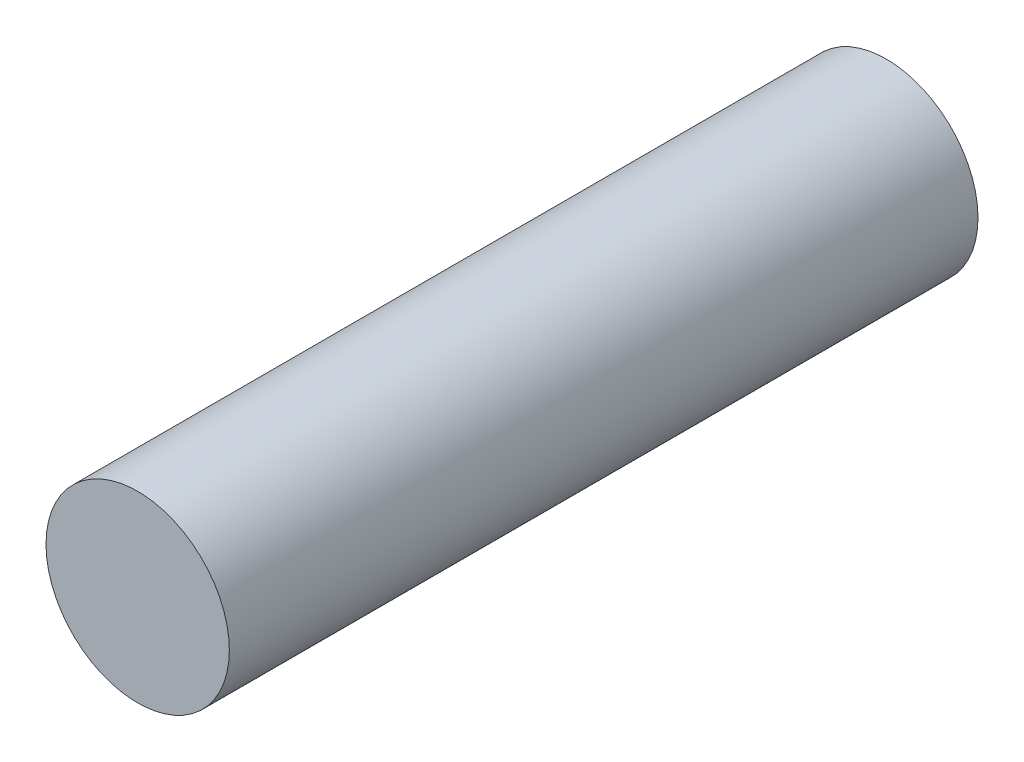
ISO-10303-21;
HEADER;
FILE_DESCRIPTION(('STEP AP214'),'2;1');
FILE_NAME('part.step','',(''),(''),'','','');
FILE_SCHEMA(('AUTOMOTIVE_DESIGN { 1 0 10303 214 1 1 1 1 }'));
ENDSEC;
DATA;
#1=APPLICATION_CONTEXT('core data for automotive mechanical design processes');
#2=APPLICATION_PROTOCOL_DEFINITION('international standard','automotive_design',2000,#1);
#3=PRODUCT_CONTEXT('',#1,'mechanical');
#4=PRODUCT('Part','Part','',(#3));
#5=PRODUCT_RELATED_PRODUCT_CATEGORY('part','',(#4));
#6=PRODUCT_DEFINITION_FORMATION('','',#4);
#7=PRODUCT_DEFINITION_CONTEXT('part definition',#1,'design');
#8=PRODUCT_DEFINITION('design','',#6,#7);
#9=PRODUCT_DEFINITION_SHAPE('','',#8);
#10=(LENGTH_UNIT() NAMED_UNIT(*) SI_UNIT(.MILLI.,.METRE.));
#11=(NAMED_UNIT(*) PLANE_ANGLE_UNIT() SI_UNIT($,.RADIAN.));
#12=(NAMED_UNIT(*) SI_UNIT($,.STERADIAN.) SOLID_ANGLE_UNIT());
#13=UNCERTAINTY_MEASURE_WITH_UNIT(LENGTH_MEASURE(1.E-05),#10,'distance_accuracy_value','');
#14=(GEOMETRIC_REPRESENTATION_CONTEXT(3) GLOBAL_UNCERTAINTY_ASSIGNED_CONTEXT((#13)) GLOBAL_UNIT_ASSIGNED_CONTEXT((#10,
#11,#12)) REPRESENTATION_CONTEXT('',''));
#15=CARTESIAN_POINT('',(0.,0.,0.));
#16=DIRECTION('',(0.,0.,1.));
#17=DIRECTION('',(1.,0.,0.));
#18=AXIS2_PLACEMENT_3D('',#15,#16,#17);
#19=CARTESIAN_POINT('',(0.,0.,25.4));
#20=DIRECTION('',(0.,0.,-1.));
#21=DIRECTION('',(-1.,0.,0.));
#22=AXIS2_PLACEMENT_3D('',#19,#20,#21);
#23=CYLINDRICAL_SURFACE('',#22,3.11);
#24=CARTESIAN_POINT('',(0.,0.,25.4));
#25=DIRECTION('',(0.,0.,1.));
#26=DIRECTION('',(1.,0.,0.));
#27=AXIS2_PLACEMENT_3D('',#24,#25,#26);
#28=CIRCLE('',#27,3.11);
#29=CARTESIAN_POINT('',(3.11,0.,25.4));
#30=VERTEX_POINT('',#29);
#31=EDGE_CURVE('E10',#30,#30,#28,.T.);
#32=ORIENTED_EDGE('',*,*,#31,.F.);
#33=EDGE_LOOP('',(#32));
#34=FACE_BOUND('',#33,.T.);
#35=CARTESIAN_POINT('',(0.,0.,0.));
#36=DIRECTION('',(0.,0.,1.));
#37=DIRECTION('',(1.,0.,0.));
#38=AXIS2_PLACEMENT_3D('',#35,#36,#37);
#39=CIRCLE('',#38,3.11);
#40=CARTESIAN_POINT('',(3.11,0.,0.));
#41=VERTEX_POINT('',#40);
#42=EDGE_CURVE('E31',#41,#41,#39,.T.);
#43=ORIENTED_EDGE('',*,*,#42,.T.);
#44=EDGE_LOOP('',(#43));
#45=FACE_BOUND('',#44,.T.);
#46=ADVANCED_FACE('F28',(#34,#45),#23,.T.);
#47=CARTESIAN_POINT('',(0.,0.,25.4));
#48=DIRECTION('',(0.,0.,1.));
#49=DIRECTION('',(1.,0.,0.));
#50=AXIS2_PLACEMENT_3D('',#47,#48,#49);
#51=PLANE('',#50);
#52=ORIENTED_EDGE('',*,*,#31,.T.);
#53=EDGE_LOOP('',(#52));
#54=FACE_BOUND('',#53,.T.);
#55=ADVANCED_FACE('F43',(#54),#51,.T.);
#56=CARTESIAN_POINT('',(0.,0.,0.));
#57=DIRECTION('',(0.,0.,1.));
#58=DIRECTION('',(1.,0.,0.));
#59=AXIS2_PLACEMENT_3D('',#56,#57,#58);
#60=PLANE('',#59);
#61=ORIENTED_EDGE('',*,*,#42,.F.);
#62=EDGE_LOOP('',(#61));
#63=FACE_BOUND('',#62,.T.);
#64=ADVANCED_FACE('F41',(#63),#60,.F.);
#65=CLOSED_SHELL('',(#46,#55,#64));
#66=MANIFOLD_SOLID_BREP('B2',#65);
#67=ADVANCED_BREP_SHAPE_REPRESENTATION('',(#18,#66),#14);
#68=SHAPE_DEFINITION_REPRESENTATION(#9,#67);
ENDSEC;
END-ISO-10303-21;
